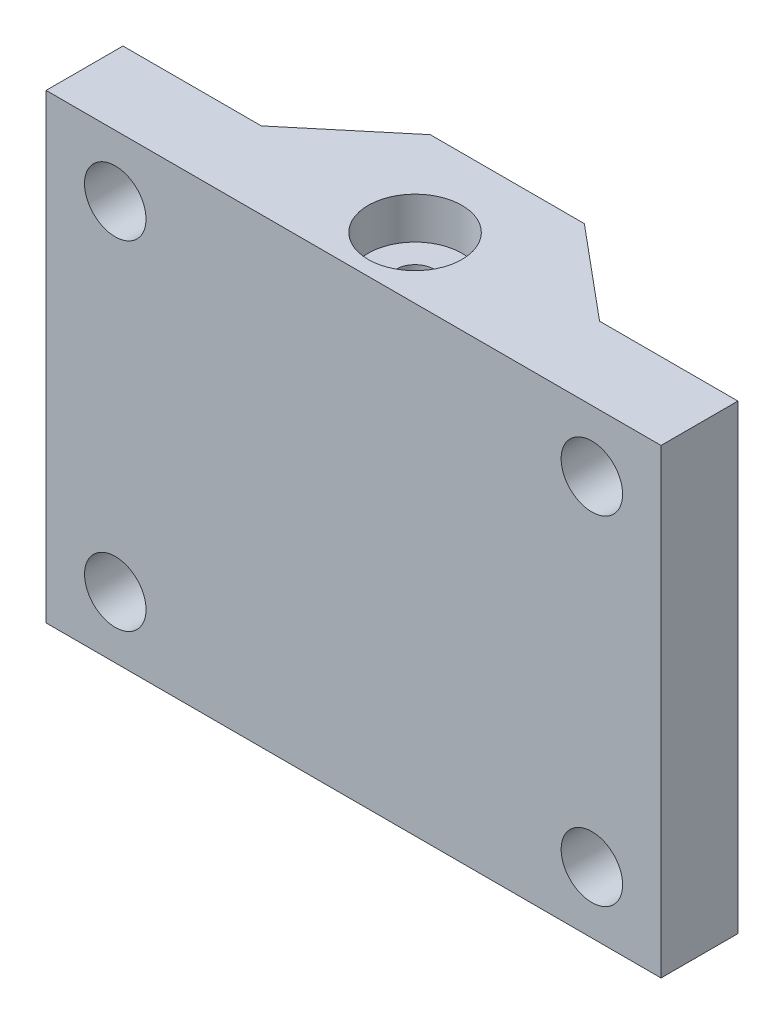
ISO-10303-21;
HEADER;
FILE_DESCRIPTION(('STEP AP214'),'2;1');
FILE_NAME('part.step','',(''),(''),'','','');
FILE_SCHEMA(('AUTOMOTIVE_DESIGN { 1 0 10303 214 1 1 1 1 }'));
ENDSEC;
DATA;
#1=APPLICATION_CONTEXT('core data for automotive mechanical design processes');
#2=APPLICATION_PROTOCOL_DEFINITION('international standard','automotive_design',2000,#1);
#3=PRODUCT_CONTEXT('',#1,'mechanical');
#4=PRODUCT('Part','Part','',(#3));
#5=PRODUCT_RELATED_PRODUCT_CATEGORY('part','',(#4));
#6=PRODUCT_DEFINITION_FORMATION('','',#4);
#7=PRODUCT_DEFINITION_CONTEXT('part definition',#1,'design');
#8=PRODUCT_DEFINITION('design','',#6,#7);
#9=PRODUCT_DEFINITION_SHAPE('','',#8);
#10=(LENGTH_UNIT() NAMED_UNIT(*) SI_UNIT(.MILLI.,.METRE.));
#11=(NAMED_UNIT(*) PLANE_ANGLE_UNIT() SI_UNIT($,.RADIAN.));
#12=(NAMED_UNIT(*) SI_UNIT($,.STERADIAN.) SOLID_ANGLE_UNIT());
#13=UNCERTAINTY_MEASURE_WITH_UNIT(LENGTH_MEASURE(1.E-05),#10,'distance_accuracy_value','');
#14=(GEOMETRIC_REPRESENTATION_CONTEXT(3) GLOBAL_UNCERTAINTY_ASSIGNED_CONTEXT((#13)) GLOBAL_UNIT_ASSIGNED_CONTEXT((#10,
#11,#12)) REPRESENTATION_CONTEXT('',''));
#15=CARTESIAN_POINT('',(0.,0.,0.));
#16=DIRECTION('',(0.,0.,1.));
#17=DIRECTION('',(1.,0.,0.));
#18=AXIS2_PLACEMENT_3D('',#15,#16,#17);
#19=CARTESIAN_POINT('',(20.,30.,-5.));
#20=DIRECTION('',(-1.,0.,0.));
#21=DIRECTION('',(0.,0.,1.));
#22=AXIS2_PLACEMENT_3D('',#19,#20,#21);
#23=PLANE('',#22);
#24=DIRECTION('',(0.,0.,-1.));
#25=VECTOR('',#24,1.);
#26=CARTESIAN_POINT('',(20.,0.,-5.));
#27=LINE('',#26,#25);
#28=CARTESIAN_POINT('',(20.,0.,0.));
#29=VERTEX_POINT('',#28);
#30=CARTESIAN_POINT('',(20.,0.,-5.));
#31=VERTEX_POINT('',#30);
#32=EDGE_CURVE('E138',#29,#31,#27,.T.);
#33=ORIENTED_EDGE('',*,*,#32,.T.);
#34=DIRECTION('',(0.,-1.,0.));
#35=VECTOR('',#34,1.);
#36=CARTESIAN_POINT('',(20.,30.,-5.));
#37=LINE('',#36,#35);
#38=CARTESIAN_POINT('',(20.,30.,-5.));
#39=VERTEX_POINT('',#38);
#40=EDGE_CURVE('E46',#39,#31,#37,.T.);
#41=ORIENTED_EDGE('',*,*,#40,.F.);
#42=DIRECTION('',(0.,0.,-1.));
#43=VECTOR('',#42,1.);
#44=CARTESIAN_POINT('',(20.,30.,-5.));
#45=LINE('',#44,#43);
#46=CARTESIAN_POINT('',(20.,30.,0.));
#47=VERTEX_POINT('',#46);
#48=EDGE_CURVE('E98',#47,#39,#45,.T.);
#49=ORIENTED_EDGE('',*,*,#48,.F.);
#50=DIRECTION('',(0.,-1.,0.));
#51=VECTOR('',#50,1.);
#52=CARTESIAN_POINT('',(20.,30.,0.));
#53=LINE('',#52,#51);
#54=EDGE_CURVE('E11',#47,#29,#53,.T.);
#55=ORIENTED_EDGE('',*,*,#54,.T.);
#56=EDGE_LOOP('',(#33,#41,#49,#55));
#57=FACE_BOUND('',#56,.T.);
#58=ADVANCED_FACE('F37',(#57),#23,.F.);
#59=CARTESIAN_POINT('',(11.,30.,-5.));
#60=DIRECTION('',(0.,0.,1.));
#61=DIRECTION('',(1.,0.,0.));
#62=AXIS2_PLACEMENT_3D('',#59,#60,#61);
#63=PLANE('',#62);
#64=CARTESIAN_POINT('',(15.5,26.,-5.));
#65=DIRECTION('',(0.,0.,-1.));
#66=DIRECTION('',(1.,0.,0.));
#67=AXIS2_PLACEMENT_3D('',#64,#65,#66);
#68=CIRCLE('',#67,2.);
#69=CARTESIAN_POINT('',(17.5,26.,-5.));
#70=VERTEX_POINT('',#69);
#71=EDGE_CURVE('E202',#70,#70,#68,.T.);
#72=ORIENTED_EDGE('',*,*,#71,.F.);
#73=EDGE_LOOP('',(#72));
#74=FACE_BOUND('',#73,.T.);
#75=CARTESIAN_POINT('',(15.5,4.,-5.));
#76=DIRECTION('',(0.,0.,-1.));
#77=DIRECTION('',(-1.,0.,0.));
#78=AXIS2_PLACEMENT_3D('',#75,#76,#77);
#79=CIRCLE('',#78,2.);
#80=CARTESIAN_POINT('',(13.5,4.,-5.));
#81=VERTEX_POINT('',#80);
#82=EDGE_CURVE('E189',#81,#81,#79,.T.);
#83=ORIENTED_EDGE('',*,*,#82,.F.);
#84=EDGE_LOOP('',(#83));
#85=FACE_BOUND('',#84,.T.);
#86=DIRECTION('',(-1.,0.,0.));
#87=VECTOR('',#86,1.);
#88=CARTESIAN_POINT('',(11.,0.,-5.));
#89=LINE('',#88,#87);
#90=CARTESIAN_POINT('',(11.,0.,-5.));
#91=VERTEX_POINT('',#90);
#92=EDGE_CURVE('E140',#31,#91,#89,.T.);
#93=ORIENTED_EDGE('',*,*,#92,.T.);
#94=DIRECTION('',(0.,-1.,0.));
#95=VECTOR('',#94,1.);
#96=CARTESIAN_POINT('',(11.,30.,-5.));
#97=LINE('',#96,#95);
#98=CARTESIAN_POINT('',(11.,30.,-5.));
#99=VERTEX_POINT('',#98);
#100=EDGE_CURVE('E158',#99,#91,#97,.T.);
#101=ORIENTED_EDGE('',*,*,#100,.F.);
#102=DIRECTION('',(-1.,0.,0.));
#103=VECTOR('',#102,1.);
#104=CARTESIAN_POINT('',(11.,30.,-5.));
#105=LINE('',#104,#103);
#106=EDGE_CURVE('E167',#39,#99,#105,.T.);
#107=ORIENTED_EDGE('',*,*,#106,.F.);
#108=ORIENTED_EDGE('',*,*,#40,.T.);
#109=EDGE_LOOP('',(#93,#101,#107,#108));
#110=FACE_BOUND('',#109,.T.);
#111=ADVANCED_FACE('F165',(#74,#85,#110),#63,.F.);
#112=CARTESIAN_POINT('',(5.01141851962929,30.,-10.));
#113=DIRECTION('',(-0.640903939049627,0.,0.767621092017847));
#114=DIRECTION('',(0.767621092017847,0.,0.640903939049627));
#115=AXIS2_PLACEMENT_3D('',#112,#113,#114);
#116=PLANE('',#115);
#117=DIRECTION('',(-0.767621092017847,0.,-0.640903939049627));
#118=VECTOR('',#117,1.);
#119=CARTESIAN_POINT('',(5.01141851962929,0.,-10.));
#120=LINE('',#119,#118);
#121=CARTESIAN_POINT('',(5.01141851962929,0.,-10.));
#122=VERTEX_POINT('',#121);
#123=EDGE_CURVE('E143',#91,#122,#120,.T.);
#124=ORIENTED_EDGE('',*,*,#123,.T.);
#125=DIRECTION('',(0.,-1.,0.));
#126=VECTOR('',#125,1.);
#127=CARTESIAN_POINT('',(5.01141851962929,30.,-10.));
#128=LINE('',#127,#126);
#129=CARTESIAN_POINT('',(5.01141851962929,30.,-10.));
#130=VERTEX_POINT('',#129);
#131=EDGE_CURVE('E155',#130,#122,#128,.T.);
#132=ORIENTED_EDGE('',*,*,#131,.F.);
#133=DIRECTION('',(-0.767621092017847,0.,-0.640903939049627));
#134=VECTOR('',#133,1.);
#135=CARTESIAN_POINT('',(5.01141851962929,30.,-10.));
#136=LINE('',#135,#134);
#137=EDGE_CURVE('E180',#99,#130,#136,.T.);
#138=ORIENTED_EDGE('',*,*,#137,.F.);
#139=ORIENTED_EDGE('',*,*,#100,.T.);
#140=EDGE_LOOP('',(#124,#132,#138,#139));
#141=FACE_BOUND('',#140,.T.);
#142=ADVANCED_FACE('F176',(#141),#116,.F.);
#143=CARTESIAN_POINT('',(-5.01141851962929,30.,-10.));
#144=DIRECTION('',(0.,0.,1.));
#145=DIRECTION('',(1.,0.,0.));
#146=AXIS2_PLACEMENT_3D('',#143,#144,#145);
#147=PLANE('',#146);
#148=DIRECTION('',(-1.,0.,0.));
#149=VECTOR('',#148,1.);
#150=CARTESIAN_POINT('',(-5.01141851962929,0.,-10.));
#151=LINE('',#150,#149);
#152=CARTESIAN_POINT('',(-5.01141851962929,0.,-10.));
#153=VERTEX_POINT('',#152);
#154=EDGE_CURVE('E145',#122,#153,#151,.T.);
#155=ORIENTED_EDGE('',*,*,#154,.T.);
#156=DIRECTION('',(0.,-1.,0.));
#157=VECTOR('',#156,1.);
#158=CARTESIAN_POINT('',(-5.01141851962929,30.,-10.));
#159=LINE('',#158,#157);
#160=CARTESIAN_POINT('',(-5.01141851962929,30.,-10.));
#161=VERTEX_POINT('',#160);
#162=EDGE_CURVE('E127',#161,#153,#159,.T.);
#163=ORIENTED_EDGE('',*,*,#162,.F.);
#164=DIRECTION('',(-1.,0.,0.));
#165=VECTOR('',#164,1.);
#166=CARTESIAN_POINT('',(-5.01141851962929,30.,-10.));
#167=LINE('',#166,#165);
#168=EDGE_CURVE('E118',#130,#161,#167,.T.);
#169=ORIENTED_EDGE('',*,*,#168,.F.);
#170=ORIENTED_EDGE('',*,*,#131,.T.);
#171=EDGE_LOOP('',(#155,#163,#169,#170));
#172=FACE_BOUND('',#171,.T.);
#173=ADVANCED_FACE('F179',(#172),#147,.F.);
#174=CARTESIAN_POINT('',(-11.,30.,-5.));
#175=DIRECTION('',(0.640903939049628,0.,0.767621092017846));
#176=DIRECTION('',(0.767621092017847,0.,-0.640903939049628));
#177=AXIS2_PLACEMENT_3D('',#174,#175,#176);
#178=PLANE('',#177);
#179=DIRECTION('',(-0.767621092017846,0.,0.640903939049628));
#180=VECTOR('',#179,1.);
#181=CARTESIAN_POINT('',(-11.,0.,-5.));
#182=LINE('',#181,#180);
#183=CARTESIAN_POINT('',(-11.,0.,-5.));
#184=VERTEX_POINT('',#183);
#185=EDGE_CURVE('E126',#153,#184,#182,.T.);
#186=ORIENTED_EDGE('',*,*,#185,.T.);
#187=DIRECTION('',(0.,-1.,0.));
#188=VECTOR('',#187,1.);
#189=CARTESIAN_POINT('',(-11.,30.,-5.));
#190=LINE('',#189,#188);
#191=CARTESIAN_POINT('',(-11.,30.,-5.));
#192=VERTEX_POINT('',#191);
#193=EDGE_CURVE('E123',#192,#184,#190,.T.);
#194=ORIENTED_EDGE('',*,*,#193,.F.);
#195=DIRECTION('',(-0.767621092017846,0.,0.640903939049628));
#196=VECTOR('',#195,1.);
#197=CARTESIAN_POINT('',(-11.,30.,-5.));
#198=LINE('',#197,#196);
#199=EDGE_CURVE('E112',#161,#192,#198,.T.);
#200=ORIENTED_EDGE('',*,*,#199,.F.);
#201=ORIENTED_EDGE('',*,*,#162,.T.);
#202=EDGE_LOOP('',(#186,#194,#200,#201));
#203=FACE_BOUND('',#202,.T.);
#204=ADVANCED_FACE('F124',(#203),#178,.F.);
#205=CARTESIAN_POINT('',(-20.,30.,-5.));
#206=DIRECTION('',(0.,0.,1.));
#207=DIRECTION('',(1.,0.,0.));
#208=AXIS2_PLACEMENT_3D('',#205,#206,#207);
#209=PLANE('',#208);
#210=CARTESIAN_POINT('',(-15.5,4.,-5.));
#211=DIRECTION('',(0.,0.,-1.));
#212=DIRECTION('',(1.,0.,0.));
#213=AXIS2_PLACEMENT_3D('',#210,#211,#212);
#214=CIRCLE('',#213,2.);
#215=CARTESIAN_POINT('',(-13.5,4.,-5.));
#216=VERTEX_POINT('',#215);
#217=EDGE_CURVE('E195',#216,#216,#214,.T.);
#218=ORIENTED_EDGE('',*,*,#217,.F.);
#219=EDGE_LOOP('',(#218));
#220=FACE_BOUND('',#219,.T.);
#221=CARTESIAN_POINT('',(-15.5,26.,-5.));
#222=DIRECTION('',(0.,0.,-1.));
#223=DIRECTION('',(-1.,0.,0.));
#224=AXIS2_PLACEMENT_3D('',#221,#222,#223);
#225=CIRCLE('',#224,2.);
#226=CARTESIAN_POINT('',(-17.5,26.,-5.));
#227=VERTEX_POINT('',#226);
#228=EDGE_CURVE('E207',#227,#227,#225,.T.);
#229=ORIENTED_EDGE('',*,*,#228,.F.);
#230=EDGE_LOOP('',(#229));
#231=FACE_BOUND('',#230,.T.);
#232=DIRECTION('',(-1.,0.,0.));
#233=VECTOR('',#232,1.);
#234=CARTESIAN_POINT('',(-20.,0.,-5.));
#235=LINE('',#234,#233);
#236=CARTESIAN_POINT('',(-20.,0.,-5.));
#237=VERTEX_POINT('',#236);
#238=EDGE_CURVE('E84',#184,#237,#235,.T.);
#239=ORIENTED_EDGE('',*,*,#238,.T.);
#240=DIRECTION('',(0.,-1.,0.));
#241=VECTOR('',#240,1.);
#242=CARTESIAN_POINT('',(-20.,30.,-5.));
#243=LINE('',#242,#241);
#244=CARTESIAN_POINT('',(-20.,30.,-5.));
#245=VERTEX_POINT('',#244);
#246=EDGE_CURVE('E128',#245,#237,#243,.T.);
#247=ORIENTED_EDGE('',*,*,#246,.F.);
#248=DIRECTION('',(-1.,0.,0.));
#249=VECTOR('',#248,1.);
#250=CARTESIAN_POINT('',(-20.,30.,-5.));
#251=LINE('',#250,#249);
#252=EDGE_CURVE('E116',#192,#245,#251,.T.);
#253=ORIENTED_EDGE('',*,*,#252,.F.);
#254=ORIENTED_EDGE('',*,*,#193,.T.);
#255=EDGE_LOOP('',(#239,#247,#253,#254));
#256=FACE_BOUND('',#255,.T.);
#257=ADVANCED_FACE('F130',(#220,#231,#256),#209,.F.);
#258=CARTESIAN_POINT('',(-20.,30.,0.));
#259=DIRECTION('',(1.,0.,0.));
#260=DIRECTION('',(0.,0.,-1.));
#261=AXIS2_PLACEMENT_3D('',#258,#259,#260);
#262=PLANE('',#261);
#263=DIRECTION('',(0.,0.,1.));
#264=VECTOR('',#263,1.);
#265=CARTESIAN_POINT('',(-20.,0.,0.));
#266=LINE('',#265,#264);
#267=CARTESIAN_POINT('',(-20.,0.,0.));
#268=VERTEX_POINT('',#267);
#269=EDGE_CURVE('E91',#237,#268,#266,.T.);
#270=ORIENTED_EDGE('',*,*,#269,.T.);
#271=DIRECTION('',(0.,-1.,0.));
#272=VECTOR('',#271,1.);
#273=CARTESIAN_POINT('',(-20.,30.,0.));
#274=LINE('',#273,#272);
#275=CARTESIAN_POINT('',(-20.,30.,0.));
#276=VERTEX_POINT('',#275);
#277=EDGE_CURVE('E134',#276,#268,#274,.T.);
#278=ORIENTED_EDGE('',*,*,#277,.F.);
#279=DIRECTION('',(0.,0.,1.));
#280=VECTOR('',#279,1.);
#281=CARTESIAN_POINT('',(-20.,30.,0.));
#282=LINE('',#281,#280);
#283=EDGE_CURVE('E132',#245,#276,#282,.T.);
#284=ORIENTED_EDGE('',*,*,#283,.F.);
#285=ORIENTED_EDGE('',*,*,#246,.T.);
#286=EDGE_LOOP('',(#270,#278,#284,#285));
#287=FACE_BOUND('',#286,.T.);
#288=ADVANCED_FACE('F243',(#287),#262,.F.);
#289=CARTESIAN_POINT('',(0.,30.,0.));
#290=DIRECTION('',(0.,0.,-1.));
#291=DIRECTION('',(-1.,0.,0.));
#292=AXIS2_PLACEMENT_3D('',#289,#290,#291);
#293=PLANE('',#292);
#294=CARTESIAN_POINT('',(15.5,26.,0.));
#295=DIRECTION('',(0.,0.,-1.));
#296=DIRECTION('',(1.,0.,0.));
#297=AXIS2_PLACEMENT_3D('',#294,#295,#296);
#298=CIRCLE('',#297,2.);
#299=CARTESIAN_POINT('',(17.5,26.,0.));
#300=VERTEX_POINT('',#299);
#301=EDGE_CURVE('E192',#300,#300,#298,.T.);
#302=ORIENTED_EDGE('',*,*,#301,.T.);
#303=EDGE_LOOP('',(#302));
#304=FACE_BOUND('',#303,.T.);
#305=CARTESIAN_POINT('',(-15.5,4.,0.));
#306=DIRECTION('',(0.,0.,-1.));
#307=DIRECTION('',(1.,0.,0.));
#308=AXIS2_PLACEMENT_3D('',#305,#306,#307);
#309=CIRCLE('',#308,2.);
#310=CARTESIAN_POINT('',(-13.5,4.,0.));
#311=VERTEX_POINT('',#310);
#312=EDGE_CURVE('E198',#311,#311,#309,.T.);
#313=ORIENTED_EDGE('',*,*,#312,.T.);
#314=EDGE_LOOP('',(#313));
#315=FACE_BOUND('',#314,.T.);
#316=CARTESIAN_POINT('',(-15.5,26.,0.));
#317=DIRECTION('',(0.,0.,-1.));
#318=DIRECTION('',(-1.,0.,0.));
#319=AXIS2_PLACEMENT_3D('',#316,#317,#318);
#320=CIRCLE('',#319,2.);
#321=CARTESIAN_POINT('',(-17.5,26.,0.));
#322=VERTEX_POINT('',#321);
#323=EDGE_CURVE('E199',#322,#322,#320,.T.);
#324=ORIENTED_EDGE('',*,*,#323,.T.);
#325=EDGE_LOOP('',(#324));
#326=FACE_BOUND('',#325,.T.);
#327=CARTESIAN_POINT('',(15.5,4.,0.));
#328=DIRECTION('',(0.,0.,-1.));
#329=DIRECTION('',(-1.,0.,0.));
#330=AXIS2_PLACEMENT_3D('',#327,#328,#329);
#331=CIRCLE('',#330,2.);
#332=CARTESIAN_POINT('',(13.5,4.,0.));
#333=VERTEX_POINT('',#332);
#334=EDGE_CURVE('E188',#333,#333,#331,.T.);
#335=ORIENTED_EDGE('',*,*,#334,.T.);
#336=EDGE_LOOP('',(#335));
#337=FACE_BOUND('',#336,.T.);
#338=DIRECTION('',(1.,0.,0.));
#339=VECTOR('',#338,1.);
#340=CARTESIAN_POINT('',(0.,0.,0.));
#341=LINE('',#340,#339);
#342=EDGE_CURVE('E150',#268,#29,#341,.T.);
#343=ORIENTED_EDGE('',*,*,#342,.T.);
#344=ORIENTED_EDGE('',*,*,#54,.F.);
#345=DIRECTION('',(1.,0.,0.));
#346=VECTOR('',#345,1.);
#347=CARTESIAN_POINT('',(20.,30.,0.));
#348=LINE('',#347,#346);
#349=EDGE_CURVE('E54',#276,#47,#348,.T.);
#350=ORIENTED_EDGE('',*,*,#349,.F.);
#351=ORIENTED_EDGE('',*,*,#277,.T.);
#352=EDGE_LOOP('',(#343,#344,#350,#351));
#353=FACE_BOUND('',#352,.T.);
#354=ADVANCED_FACE('F242',(#304,#315,#326,#337,#353),#293,.F.);
#355=CARTESIAN_POINT('',(0.,30.,0.));
#356=DIRECTION('',(0.,-1.,0.));
#357=DIRECTION('',(0.,0.,-1.));
#358=AXIS2_PLACEMENT_3D('',#355,#356,#357);
#359=PLANE('',#358);
#360=CARTESIAN_POINT('',(0.,30.,-4.));
#361=DIRECTION('',(0.,1.,0.));
#362=DIRECTION('',(0.,0.,1.));
#363=AXIS2_PLACEMENT_3D('',#360,#361,#362);
#364=CIRCLE('',#363,3.05);
#365=CARTESIAN_POINT('',(0.,30.,-0.95));
#366=VERTEX_POINT('',#365);
#367=EDGE_CURVE('E212',#366,#366,#364,.T.);
#368=ORIENTED_EDGE('',*,*,#367,.F.);
#369=EDGE_LOOP('',(#368));
#370=FACE_BOUND('',#369,.T.);
#371=ORIENTED_EDGE('',*,*,#349,.T.);
#372=ORIENTED_EDGE('',*,*,#48,.T.);
#373=ORIENTED_EDGE('',*,*,#106,.T.);
#374=ORIENTED_EDGE('',*,*,#137,.T.);
#375=ORIENTED_EDGE('',*,*,#168,.T.);
#376=ORIENTED_EDGE('',*,*,#199,.T.);
#377=ORIENTED_EDGE('',*,*,#252,.T.);
#378=ORIENTED_EDGE('',*,*,#283,.T.);
#379=EDGE_LOOP('',(#371,#372,#373,#374,#375,#376,#377,#378));
#380=FACE_BOUND('',#379,.T.);
#381=ADVANCED_FACE('F114',(#370,#380),#359,.F.);
#382=CARTESIAN_POINT('',(0.,0.,0.));
#383=DIRECTION('',(0.,-1.,0.));
#384=DIRECTION('',(0.,0.,-1.));
#385=AXIS2_PLACEMENT_3D('',#382,#383,#384);
#386=PLANE('',#385);
#387=ORIENTED_EDGE('',*,*,#32,.F.);
#388=ORIENTED_EDGE('',*,*,#342,.F.);
#389=ORIENTED_EDGE('',*,*,#269,.F.);
#390=ORIENTED_EDGE('',*,*,#238,.F.);
#391=ORIENTED_EDGE('',*,*,#185,.F.);
#392=ORIENTED_EDGE('',*,*,#154,.F.);
#393=ORIENTED_EDGE('',*,*,#123,.F.);
#394=ORIENTED_EDGE('',*,*,#92,.F.);
#395=EDGE_LOOP('',(#387,#388,#389,#390,#391,#392,#393,#394));
#396=FACE_BOUND('',#395,.T.);
#397=ADVANCED_FACE('F171',(#396),#386,.T.);
#398=CARTESIAN_POINT('',(15.5,4.,0.));
#399=DIRECTION('',(0.,0.,-1.));
#400=DIRECTION('',(-1.,0.,0.));
#401=AXIS2_PLACEMENT_3D('',#398,#399,#400);
#402=CYLINDRICAL_SURFACE('',#401,2.);
#403=ORIENTED_EDGE('',*,*,#334,.F.);
#404=EDGE_LOOP('',(#403));
#405=FACE_BOUND('',#404,.T.);
#406=ORIENTED_EDGE('',*,*,#82,.T.);
#407=EDGE_LOOP('',(#406));
#408=FACE_BOUND('',#407,.T.);
#409=ADVANCED_FACE('F295',(#405,#408),#402,.F.);
#410=CARTESIAN_POINT('',(-15.5,26.,0.));
#411=DIRECTION('',(0.,0.,-1.));
#412=DIRECTION('',(-1.,0.,0.));
#413=AXIS2_PLACEMENT_3D('',#410,#411,#412);
#414=CYLINDRICAL_SURFACE('',#413,2.);
#415=ORIENTED_EDGE('',*,*,#323,.F.);
#416=EDGE_LOOP('',(#415));
#417=FACE_BOUND('',#416,.T.);
#418=ORIENTED_EDGE('',*,*,#228,.T.);
#419=EDGE_LOOP('',(#418));
#420=FACE_BOUND('',#419,.T.);
#421=ADVANCED_FACE('F300',(#417,#420),#414,.F.);
#422=CARTESIAN_POINT('',(-15.5,4.,0.));
#423=DIRECTION('',(0.,0.,-1.));
#424=DIRECTION('',(-1.,0.,0.));
#425=AXIS2_PLACEMENT_3D('',#422,#423,#424);
#426=CYLINDRICAL_SURFACE('',#425,2.);
#427=ORIENTED_EDGE('',*,*,#312,.F.);
#428=EDGE_LOOP('',(#427));
#429=FACE_BOUND('',#428,.T.);
#430=ORIENTED_EDGE('',*,*,#217,.T.);
#431=EDGE_LOOP('',(#430));
#432=FACE_BOUND('',#431,.T.);
#433=ADVANCED_FACE('F312',(#429,#432),#426,.F.);
#434=CARTESIAN_POINT('',(15.5,26.,0.));
#435=DIRECTION('',(0.,0.,-1.));
#436=DIRECTION('',(-1.,0.,0.));
#437=AXIS2_PLACEMENT_3D('',#434,#435,#436);
#438=CYLINDRICAL_SURFACE('',#437,2.);
#439=ORIENTED_EDGE('',*,*,#301,.F.);
#440=EDGE_LOOP('',(#439));
#441=FACE_BOUND('',#440,.T.);
#442=ORIENTED_EDGE('',*,*,#71,.T.);
#443=EDGE_LOOP('',(#442));
#444=FACE_BOUND('',#443,.T.);
#445=ADVANCED_FACE('F322',(#441,#444),#438,.F.);
#446=CARTESIAN_POINT('',(0.,27.3,-4.));
#447=DIRECTION('',(0.,1.,0.));
#448=DIRECTION('',(0.,0.,1.));
#449=AXIS2_PLACEMENT_3D('',#446,#447,#448);
#450=PLANE('',#449);
#451=CARTESIAN_POINT('',(0.,27.3,-4.));
#452=DIRECTION('',(0.,1.,0.));
#453=DIRECTION('',(0.,0.,1.));
#454=AXIS2_PLACEMENT_3D('',#451,#452,#453);
#455=CIRCLE('',#454,3.05);
#456=CARTESIAN_POINT('',(0.,27.3,-0.95));
#457=VERTEX_POINT('',#456);
#458=EDGE_CURVE('E215',#457,#457,#455,.T.);
#459=ORIENTED_EDGE('',*,*,#458,.T.);
#460=EDGE_LOOP('',(#459));
#461=FACE_BOUND('',#460,.T.);
#462=CARTESIAN_POINT('',(0.,27.3,-4.));
#463=DIRECTION('',(0.,1.,0.));
#464=DIRECTION('',(0.,0.,1.));
#465=AXIS2_PLACEMENT_3D('',#462,#463,#464);
#466=CIRCLE('',#465,1.25);
#467=CARTESIAN_POINT('',(0.,27.3,-2.75));
#468=VERTEX_POINT('',#467);
#469=EDGE_CURVE('E40',#468,#468,#466,.F.);
#470=ORIENTED_EDGE('',*,*,#469,.T.);
#471=EDGE_LOOP('',(#470));
#472=FACE_BOUND('',#471,.T.);
#473=ADVANCED_FACE('F222',(#461,#472),#450,.T.);
#474=CARTESIAN_POINT('',(0.,27.3,-4.));
#475=DIRECTION('',(0.,1.,0.));
#476=DIRECTION('',(0.,0.,1.));
#477=AXIS2_PLACEMENT_3D('',#474,#475,#476);
#478=CYLINDRICAL_SURFACE('',#477,3.05);
#479=CARTESIAN_POINT('',(0.,27.3,-0.95));
#480=CARTESIAN_POINT('',(0.,27.328125,-0.95));
#481=CARTESIAN_POINT('',(0.,27.35625,-0.95));
#482=CARTESIAN_POINT('',(0.,27.4125,-0.95));
#483=CARTESIAN_POINT('',(0.,27.440625,-0.95));
#484=CARTESIAN_POINT('',(0.,27.496875,-0.95));
#485=CARTESIAN_POINT('',(0.,27.525,-0.95));
#486=CARTESIAN_POINT('',(0.,27.58125,-0.95));
#487=CARTESIAN_POINT('',(0.,27.609375,-0.95));
#488=CARTESIAN_POINT('',(0.,27.665625,-0.95));
#489=CARTESIAN_POINT('',(0.,27.69375,-0.95));
#490=CARTESIAN_POINT('',(0.,27.75,-0.95));
#491=CARTESIAN_POINT('',(0.,27.778125,-0.95));
#492=CARTESIAN_POINT('',(0.,27.834375,-0.95));
#493=CARTESIAN_POINT('',(0.,27.8625,-0.95));
#494=CARTESIAN_POINT('',(0.,27.91875,-0.95));
#495=CARTESIAN_POINT('',(0.,27.946875,-0.95));
#496=CARTESIAN_POINT('',(0.,28.003125,-0.95));
#497=CARTESIAN_POINT('',(0.,28.03125,-0.95));
#498=CARTESIAN_POINT('',(0.,28.0875,-0.95));
#499=CARTESIAN_POINT('',(0.,28.115625,-0.95));
#500=CARTESIAN_POINT('',(0.,28.171875,-0.95));
#501=CARTESIAN_POINT('',(0.,28.2,-0.95));
#502=CARTESIAN_POINT('',(0.,28.25625,-0.95));
#503=CARTESIAN_POINT('',(0.,28.284375,-0.95));
#504=CARTESIAN_POINT('',(0.,28.340625,-0.95));
#505=CARTESIAN_POINT('',(0.,28.36875,-0.95));
#506=CARTESIAN_POINT('',(0.,28.425,-0.95));
#507=CARTESIAN_POINT('',(0.,28.453125,-0.95));
#508=CARTESIAN_POINT('',(0.,28.509375,-0.95));
#509=CARTESIAN_POINT('',(0.,28.5375,-0.95));
#510=CARTESIAN_POINT('',(0.,28.59375,-0.95));
#511=CARTESIAN_POINT('',(0.,28.621875,-0.95));
#512=CARTESIAN_POINT('',(0.,28.678125,-0.95));
#513=CARTESIAN_POINT('',(0.,28.70625,-0.95));
#514=CARTESIAN_POINT('',(0.,28.7625,-0.95));
#515=CARTESIAN_POINT('',(0.,28.790625,-0.95));
#516=CARTESIAN_POINT('',(0.,28.846875,-0.95));
#517=CARTESIAN_POINT('',(0.,28.875,-0.95));
#518=CARTESIAN_POINT('',(0.,28.93125,-0.95));
#519=CARTESIAN_POINT('',(0.,28.959375,-0.95));
#520=CARTESIAN_POINT('',(0.,29.015625,-0.95));
#521=CARTESIAN_POINT('',(0.,29.04375,-0.95));
#522=CARTESIAN_POINT('',(0.,29.1,-0.95));
#523=CARTESIAN_POINT('',(0.,29.128125,-0.95));
#524=CARTESIAN_POINT('',(0.,29.184375,-0.95));
#525=CARTESIAN_POINT('',(0.,29.2125,-0.95));
#526=CARTESIAN_POINT('',(0.,29.26875,-0.95));
#527=CARTESIAN_POINT('',(0.,29.296875,-0.95));
#528=CARTESIAN_POINT('',(0.,29.353125,-0.95));
#529=CARTESIAN_POINT('',(0.,29.38125,-0.95));
#530=CARTESIAN_POINT('',(0.,29.4375,-0.95));
#531=CARTESIAN_POINT('',(0.,29.465625,-0.95));
#532=CARTESIAN_POINT('',(0.,29.521875,-0.95));
#533=CARTESIAN_POINT('',(0.,29.55,-0.95));
#534=CARTESIAN_POINT('',(0.,29.60625,-0.95));
#535=CARTESIAN_POINT('',(0.,29.634375,-0.95));
#536=CARTESIAN_POINT('',(0.,29.690625,-0.95));
#537=CARTESIAN_POINT('',(0.,29.71875,-0.95));
#538=CARTESIAN_POINT('',(0.,29.775,-0.95));
#539=CARTESIAN_POINT('',(0.,29.803125,-0.95));
#540=CARTESIAN_POINT('',(0.,29.859375,-0.95));
#541=CARTESIAN_POINT('',(0.,29.8875,-0.95));
#542=CARTESIAN_POINT('',(0.,29.94375,-0.95));
#543=CARTESIAN_POINT('',(0.,29.971875,-0.95));
#544=CARTESIAN_POINT('',(0.,30.,-0.95));
#545=B_SPLINE_CURVE_WITH_KNOTS('',3,(#479,#480,#481,#482,#483,#484,#485,#486,#487,#488,#489,
#490,#491,#492,#493,#494,#495,#496,#497,#498,#499,#500,#501,#502,#503,#504,#505,#506,#507,#508,
#509,#510,#511,#512,#513,#514,#515,#516,#517,#518,#519,#520,#521,#522,#523,#524,#525,#526,#527,
#528,#529,#530,#531,#532,#533,#534,#535,#536,#537,#538,#539,#540,#541,#542,#543,#544),
.UNSPECIFIED.,.F.,.F.,(4,2,2,2,2,2,2,2,2,2,2,2,2,2,2,2,2,2,2,2,2,2,2,2,2,2,2,2,2,2,2,2,4),(0.,
0.0843750000000011,0.168750000000002,0.253125000000003,0.337500000000001,0.421875000000002,
0.506250000000003,0.590625000000001,0.675000000000002,0.759375000000003,0.843750000000001,
0.928125000000002,1.0125,1.096875,1.18125,1.265625,1.35,1.434375,1.51875,1.603125,1.6875,
1.771875,1.85625,1.940625,2.025,2.109375,2.19375,2.278125,2.3625,2.446875,2.53125,2.615625,2.7),.UNSPECIFIED.);
#546=EDGE_CURVE('BSEAM232',#457,#366,#545,.T.);
#547=ORIENTED_EDGE('',*,*,#458,.F.);
#548=ORIENTED_EDGE('',*,*,#367,.T.);
#549=ORIENTED_EDGE('',*,*,#546,.T.);
#550=ORIENTED_EDGE('',*,*,#546,.F.);
#551=EDGE_LOOP('',(#547,#549,#548,#550));
#552=FACE_BOUND('',#551,.T.);
#553=ADVANCED_FACE('F232',(#552),#478,.F.);
#554=CARTESIAN_POINT('',(0.,20.,-4.));
#555=DIRECTION('',(0.,1.,0.));
#556=DIRECTION('',(0.,0.,1.));
#557=AXIS2_PLACEMENT_3D('',#554,#555,#556);
#558=PLANE('',#557);
#559=CARTESIAN_POINT('',(0.,20.,-4.));
#560=DIRECTION('',(0.,1.,0.));
#561=DIRECTION('',(0.,0.,1.));
#562=AXIS2_PLACEMENT_3D('',#559,#560,#561);
#563=CIRCLE('',#562,1.25);
#564=CARTESIAN_POINT('',(0.,20.,-2.75));
#565=VERTEX_POINT('',#564);
#566=EDGE_CURVE('E141',#565,#565,#563,.T.);
#567=ORIENTED_EDGE('',*,*,#566,.T.);
#568=EDGE_LOOP('',(#567));
#569=FACE_BOUND('',#568,.T.);
#570=ADVANCED_FACE('F226',(#569),#558,.T.);
#571=CARTESIAN_POINT('',(0.,20.,-4.));
#572=DIRECTION('',(0.,1.,0.));
#573=DIRECTION('',(0.,0.,1.));
#574=AXIS2_PLACEMENT_3D('',#571,#572,#573);
#575=CYLINDRICAL_SURFACE('',#574,1.25);
#576=ORIENTED_EDGE('',*,*,#566,.F.);
#577=EDGE_LOOP('',(#576));
#578=FACE_BOUND('',#577,.T.);
#579=ORIENTED_EDGE('',*,*,#469,.F.);
#580=EDGE_LOOP('',(#579));
#581=FACE_BOUND('',#580,.T.);
#582=ADVANCED_FACE('F224',(#578,#581),#575,.F.);
#583=CLOSED_SHELL('',(#58,#111,#142,#173,#204,#257,#288,#354,#381,#397,#409,#421,#433,#445,#473,
#553,#570,#582));
#584=MANIFOLD_SOLID_BREP('B2',#583);
#585=ADVANCED_BREP_SHAPE_REPRESENTATION('',(#18,#584),#14);
#586=SHAPE_DEFINITION_REPRESENTATION(#9,#585);
ENDSEC;
END-ISO-10303-21;
